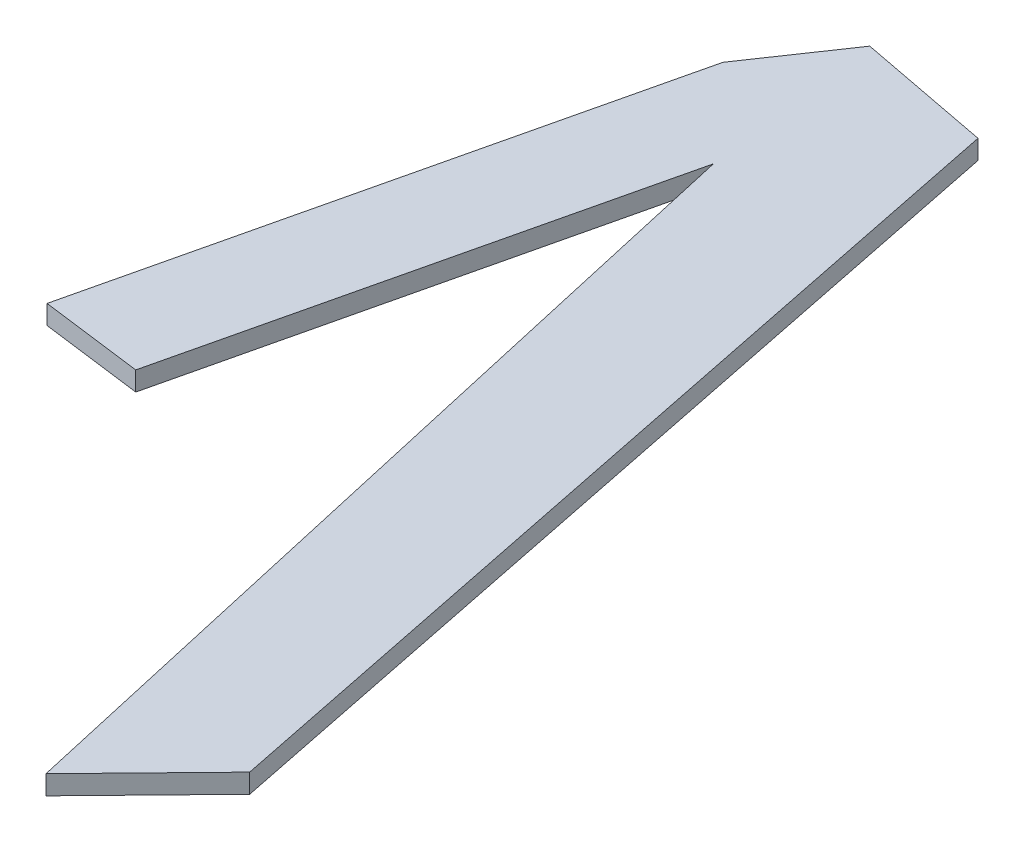
ISO-10303-21;
HEADER;
FILE_DESCRIPTION(('STEP AP214'),'2;1');
FILE_NAME('part.step','',(''),(''),'','','');
FILE_SCHEMA(('AUTOMOTIVE_DESIGN { 1 0 10303 214 1 1 1 1 }'));
ENDSEC;
DATA;
#1=APPLICATION_CONTEXT('core data for automotive mechanical design processes');
#2=APPLICATION_PROTOCOL_DEFINITION('international standard','automotive_design',2000,#1);
#3=PRODUCT_CONTEXT('',#1,'mechanical');
#4=PRODUCT('Part','Part','',(#3));
#5=PRODUCT_RELATED_PRODUCT_CATEGORY('part','',(#4));
#6=PRODUCT_DEFINITION_FORMATION('','',#4);
#7=PRODUCT_DEFINITION_CONTEXT('part definition',#1,'design');
#8=PRODUCT_DEFINITION('design','',#6,#7);
#9=PRODUCT_DEFINITION_SHAPE('','',#8);
#10=(LENGTH_UNIT() NAMED_UNIT(*) SI_UNIT(.MILLI.,.METRE.));
#11=(NAMED_UNIT(*) PLANE_ANGLE_UNIT() SI_UNIT($,.RADIAN.));
#12=(NAMED_UNIT(*) SI_UNIT($,.STERADIAN.) SOLID_ANGLE_UNIT());
#13=UNCERTAINTY_MEASURE_WITH_UNIT(LENGTH_MEASURE(1.E-05),#10,'distance_accuracy_value','');
#14=(GEOMETRIC_REPRESENTATION_CONTEXT(3) GLOBAL_UNCERTAINTY_ASSIGNED_CONTEXT((#13)) GLOBAL_UNIT_ASSIGNED_CONTEXT((#10,
#11,#12)) REPRESENTATION_CONTEXT('',''));
#15=CARTESIAN_POINT('',(0.,0.,0.));
#16=DIRECTION('',(0.,0.,1.));
#17=DIRECTION('',(1.,0.,0.));
#18=AXIS2_PLACEMENT_3D('',#15,#16,#17);
#19=CARTESIAN_POINT('',(10.1241005668503,1.,44.8720691267107));
#20=DIRECTION('',(0.975479763624145,0.,-0.220089142757614));
#21=DIRECTION('',(-0.220089142757614,0.,-0.975479763624145));
#22=AXIS2_PLACEMENT_3D('',#19,#20,#21);
#23=PLANE('',#22);
#24=DIRECTION('',(0.220089142757614,0.,0.975479763624145));
#25=VECTOR('',#24,1.);
#26=CARTESIAN_POINT('',(10.1241005668503,0.,44.8720691267107));
#27=LINE('',#26,#25);
#28=CARTESIAN_POINT('',(0.,0.,0.));
#29=VERTEX_POINT('',#28);
#30=CARTESIAN_POINT('',(10.1241005668503,0.,44.8720691267107));
#31=VERTEX_POINT('',#30);
#32=EDGE_CURVE('E140',#29,#31,#27,.T.);
#33=ORIENTED_EDGE('',*,*,#32,.T.);
#34=DIRECTION('',(0.,-1.,0.));
#35=VECTOR('',#34,1.);
#36=CARTESIAN_POINT('',(10.1241005668503,1.,44.8720691267107));
#37=LINE('',#36,#35);
#38=CARTESIAN_POINT('',(10.1241005668503,1.,44.8720691267107));
#39=VERTEX_POINT('',#38);
#40=EDGE_CURVE('E11',#39,#31,#37,.T.);
#41=ORIENTED_EDGE('',*,*,#40,.F.);
#42=DIRECTION('',(0.220089142757614,0.,0.975479763624145));
#43=VECTOR('',#42,1.);
#44=CARTESIAN_POINT('',(10.1241005668503,1.,44.8720691267107));
#45=LINE('',#44,#43);
#46=CARTESIAN_POINT('',(0.,1.,0.));
#47=VERTEX_POINT('',#46);
#48=EDGE_CURVE('E162',#47,#39,#45,.T.);
#49=ORIENTED_EDGE('',*,*,#48,.F.);
#50=DIRECTION('',(0.,-1.,0.));
#51=VECTOR('',#50,1.);
#52=CARTESIAN_POINT('',(0.,1.,0.));
#53=LINE('',#52,#51);
#54=EDGE_CURVE('E136',#47,#29,#53,.T.);
#55=ORIENTED_EDGE('',*,*,#54,.T.);
#56=EDGE_LOOP('',(#33,#41,#49,#55));
#57=FACE_BOUND('',#56,.T.);
#58=ADVANCED_FACE('F39',(#57),#23,.F.);
#59=CARTESIAN_POINT('',(15.3560523125179,1.,39.4983664059599));
#60=DIRECTION('',(-0.716493696100111,0.,-0.697593566089025));
#61=DIRECTION('',(-0.697593566089025,0.,0.716493696100111));
#62=AXIS2_PLACEMENT_3D('',#59,#60,#61);
#63=PLANE('',#62);
#64=DIRECTION('',(0.697593566089025,0.,-0.71649369610011));
#65=VECTOR('',#64,1.);
#66=CARTESIAN_POINT('',(15.3560523125179,0.,39.4983664059599));
#67=LINE('',#66,#65);
#68=CARTESIAN_POINT('',(15.3560523125179,0.,39.4983664059599));
#69=VERTEX_POINT('',#68);
#70=EDGE_CURVE('E144',#31,#69,#67,.T.);
#71=ORIENTED_EDGE('',*,*,#70,.T.);
#72=DIRECTION('',(0.,-1.,0.));
#73=VECTOR('',#72,1.);
#74=CARTESIAN_POINT('',(15.3560523125179,1.,39.4983664059599));
#75=LINE('',#74,#73);
#76=CARTESIAN_POINT('',(15.3560523125179,1.,39.4983664059599));
#77=VERTEX_POINT('',#76);
#78=EDGE_CURVE('E48',#77,#69,#75,.T.);
#79=ORIENTED_EDGE('',*,*,#78,.F.);
#80=DIRECTION('',(0.697593566089025,0.,-0.71649369610011));
#81=VECTOR('',#80,1.);
#82=CARTESIAN_POINT('',(15.3560523125179,1.,39.4983664059599));
#83=LINE('',#82,#81);
#84=EDGE_CURVE('E99',#39,#77,#83,.T.);
#85=ORIENTED_EDGE('',*,*,#84,.F.);
#86=ORIENTED_EDGE('',*,*,#40,.T.);
#87=EDGE_LOOP('',(#71,#79,#85,#86));
#88=FACE_BOUND('',#87,.T.);
#89=ADVANCED_FACE('F208',(#88),#63,.F.);
#90=CARTESIAN_POINT('',(5.73698486146157,1.,-8.03818312565874));
#91=DIRECTION('',(-0.980135041889043,0.,0.198331287650647));
#92=DIRECTION('',(0.198331287650647,0.,0.980135041889043));
#93=AXIS2_PLACEMENT_3D('',#90,#91,#92);
#94=PLANE('',#93);
#95=DIRECTION('',(-0.198331287650647,0.,-0.980135041889043));
#96=VECTOR('',#95,1.);
#97=CARTESIAN_POINT('',(5.73698486146157,0.,-8.03818312565874));
#98=LINE('',#97,#96);
#99=CARTESIAN_POINT('',(5.73698486146157,0.,-8.03818312565874));
#100=VERTEX_POINT('',#99);
#101=EDGE_CURVE('E147',#69,#100,#98,.T.);
#102=ORIENTED_EDGE('',*,*,#101,.T.);
#103=DIRECTION('',(0.,-1.,0.));
#104=VECTOR('',#103,1.);
#105=CARTESIAN_POINT('',(5.73698486146157,1.,-8.03818312565874));
#106=LINE('',#105,#104);
#107=CARTESIAN_POINT('',(5.73698486146157,1.,-8.03818312565874));
#108=VERTEX_POINT('',#107);
#109=EDGE_CURVE('E173',#108,#100,#106,.T.);
#110=ORIENTED_EDGE('',*,*,#109,.F.);
#111=DIRECTION('',(-0.198331287650647,0.,-0.980135041889043));
#112=VECTOR('',#111,1.);
#113=CARTESIAN_POINT('',(5.73698486146157,1.,-8.03818312565874));
#114=LINE('',#113,#112);
#115=EDGE_CURVE('E183',#77,#108,#114,.T.);
#116=ORIENTED_EDGE('',*,*,#115,.F.);
#117=ORIENTED_EDGE('',*,*,#78,.T.);
#118=EDGE_LOOP('',(#102,#110,#116,#117));
#119=FACE_BOUND('',#118,.T.);
#120=ADVANCED_FACE('F181',(#119),#94,.F.);
#121=CARTESIAN_POINT('',(-1.23599952786391,1.,-9.37515309773109));
#122=DIRECTION('',(-0.188305629869345,0.,0.982110477369786));
#123=DIRECTION('',(0.982110477369786,0.,0.188305629869345));
#124=AXIS2_PLACEMENT_3D('',#121,#122,#123);
#125=PLANE('',#124);
#126=DIRECTION('',(-0.982110477369786,0.,-0.188305629869345));
#127=VECTOR('',#126,1.);
#128=CARTESIAN_POINT('',(-1.23599952786391,0.,-9.37515309773109));
#129=LINE('',#128,#127);
#130=CARTESIAN_POINT('',(-1.23599952786391,0.,-9.37515309773109));
#131=VERTEX_POINT('',#130);
#132=EDGE_CURVE('E150',#100,#131,#129,.T.);
#133=ORIENTED_EDGE('',*,*,#132,.T.);
#134=DIRECTION('',(0.,-1.,0.));
#135=VECTOR('',#134,1.);
#136=CARTESIAN_POINT('',(-1.23599952786391,1.,-9.37515309773109));
#137=LINE('',#136,#135);
#138=CARTESIAN_POINT('',(-1.23599952786391,1.,-9.37515309773109));
#139=VERTEX_POINT('',#138);
#140=EDGE_CURVE('E169',#139,#131,#137,.T.);
#141=ORIENTED_EDGE('',*,*,#140,.F.);
#142=DIRECTION('',(-0.982110477369786,0.,-0.188305629869345));
#143=VECTOR('',#142,1.);
#144=CARTESIAN_POINT('',(-1.23599952786391,1.,-9.37515309773109));
#145=LINE('',#144,#143);
#146=EDGE_CURVE('E196',#108,#139,#145,.T.);
#147=ORIENTED_EDGE('',*,*,#146,.F.);
#148=ORIENTED_EDGE('',*,*,#109,.T.);
#149=EDGE_LOOP('',(#133,#141,#147,#148));
#150=FACE_BOUND('',#149,.T.);
#151=ADVANCED_FACE('F191',(#150),#125,.F.);
#152=CARTESIAN_POINT('',(-4.32854618814973,1.,-4.82694958931647));
#153=DIRECTION('',(0.826946092439021,0.,0.562281210961059));
#154=DIRECTION('',(0.562281210961059,0.,-0.826946092439021));
#155=AXIS2_PLACEMENT_3D('',#152,#153,#154);
#156=PLANE('',#155);
#157=DIRECTION('',(-0.562281210961059,0.,0.826946092439021));
#158=VECTOR('',#157,1.);
#159=CARTESIAN_POINT('',(-4.32854618814973,0.,-4.82694958931647));
#160=LINE('',#159,#158);
#161=CARTESIAN_POINT('',(-4.32854618814973,0.,-4.82694958931647));
#162=VERTEX_POINT('',#161);
#163=EDGE_CURVE('E153',#131,#162,#160,.T.);
#164=ORIENTED_EDGE('',*,*,#163,.T.);
#165=DIRECTION('',(0.,-1.,0.));
#166=VECTOR('',#165,1.);
#167=CARTESIAN_POINT('',(-4.32854618814973,1.,-4.82694958931647));
#168=LINE('',#167,#166);
#169=CARTESIAN_POINT('',(-4.32854618814973,1.,-4.82694958931647));
#170=VERTEX_POINT('',#169);
#171=EDGE_CURVE('E129',#170,#162,#168,.T.);
#172=ORIENTED_EDGE('',*,*,#171,.F.);
#173=DIRECTION('',(-0.562281210961059,0.,0.826946092439021));
#174=VECTOR('',#173,1.);
#175=CARTESIAN_POINT('',(-4.32854618814973,1.,-4.82694958931647));
#176=LINE('',#175,#174);
#177=EDGE_CURVE('E118',#139,#170,#176,.T.);
#178=ORIENTED_EDGE('',*,*,#177,.F.);
#179=ORIENTED_EDGE('',*,*,#140,.T.);
#180=EDGE_LOOP('',(#164,#172,#178,#179));
#181=FACE_BOUND('',#180,.T.);
#182=ADVANCED_FACE('F194',(#181),#156,.F.);
#183=CARTESIAN_POINT('',(-11.0504118040514,1.,23.6402073224961));
#184=DIRECTION('',(0.973236133737182,0.,0.229807371483818));
#185=DIRECTION('',(0.229807371483818,0.,-0.973236133737182));
#186=AXIS2_PLACEMENT_3D('',#183,#184,#185);
#187=PLANE('',#186);
#188=DIRECTION('',(-0.229807371483818,0.,0.973236133737182));
#189=VECTOR('',#188,1.);
#190=CARTESIAN_POINT('',(-11.0504118040514,0.,23.6402073224961));
#191=LINE('',#190,#189);
#192=CARTESIAN_POINT('',(-11.0504118040514,0.,23.6402073224961));
#193=VERTEX_POINT('',#192);
#194=EDGE_CURVE('E127',#162,#193,#191,.T.);
#195=ORIENTED_EDGE('',*,*,#194,.T.);
#196=DIRECTION('',(0.,-1.,0.));
#197=VECTOR('',#196,1.);
#198=CARTESIAN_POINT('',(-11.0504118040514,1.,23.6402073224961));
#199=LINE('',#198,#197);
#200=CARTESIAN_POINT('',(-11.0504118040514,1.,23.6402073224961));
#201=VERTEX_POINT('',#200);
#202=EDGE_CURVE('E124',#201,#193,#199,.T.);
#203=ORIENTED_EDGE('',*,*,#202,.F.);
#204=DIRECTION('',(-0.229807371483818,0.,0.973236133737182));
#205=VECTOR('',#204,1.);
#206=CARTESIAN_POINT('',(-11.0504118040514,1.,23.6402073224961));
#207=LINE('',#206,#205);
#208=EDGE_CURVE('E112',#170,#201,#207,.T.);
#209=ORIENTED_EDGE('',*,*,#208,.F.);
#210=ORIENTED_EDGE('',*,*,#171,.T.);
#211=EDGE_LOOP('',(#195,#203,#209,#210));
#212=FACE_BOUND('',#211,.T.);
#213=ADVANCED_FACE('F125',(#212),#187,.F.);
#214=CARTESIAN_POINT('',(-5.74518428709545,1.,24.3309033434296));
#215=DIRECTION('',(0.12910205998756,0.,-0.991631311580553));
#216=DIRECTION('',(-0.991631311580553,0.,-0.12910205998756));
#217=AXIS2_PLACEMENT_3D('',#214,#215,#216);
#218=PLANE('',#217);
#219=DIRECTION('',(0.991631311580553,0.,0.12910205998756));
#220=VECTOR('',#219,1.);
#221=CARTESIAN_POINT('',(-5.74518428709545,0.,24.3309033434296));
#222=LINE('',#221,#220);
#223=CARTESIAN_POINT('',(-5.74518428709545,0.,24.3309033434296));
#224=VERTEX_POINT('',#223);
#225=EDGE_CURVE('E85',#193,#224,#222,.T.);
#226=ORIENTED_EDGE('',*,*,#225,.T.);
#227=DIRECTION('',(0.,-1.,0.));
#228=VECTOR('',#227,1.);
#229=CARTESIAN_POINT('',(-5.74518428709545,1.,24.3309033434296));
#230=LINE('',#229,#228);
#231=CARTESIAN_POINT('',(-5.74518428709545,1.,24.3309033434296));
#232=VERTEX_POINT('',#231);
#233=EDGE_CURVE('E130',#232,#224,#230,.T.);
#234=ORIENTED_EDGE('',*,*,#233,.F.);
#235=DIRECTION('',(0.991631311580553,0.,0.12910205998756));
#236=VECTOR('',#235,1.);
#237=CARTESIAN_POINT('',(-5.74518428709545,1.,24.3309033434296));
#238=LINE('',#237,#236);
#239=EDGE_CURVE('E116',#201,#232,#238,.T.);
#240=ORIENTED_EDGE('',*,*,#239,.F.);
#241=ORIENTED_EDGE('',*,*,#202,.T.);
#242=EDGE_LOOP('',(#226,#234,#240,#241));
#243=FACE_BOUND('',#242,.T.);
#244=ADVANCED_FACE('F132',(#243),#218,.F.);
#245=CARTESIAN_POINT('',(0.,1.,0.));
#246=DIRECTION('',(-0.973236133737182,0.,-0.229807371483818));
#247=DIRECTION('',(-0.229807371483818,0.,0.973236133737182));
#248=AXIS2_PLACEMENT_3D('',#245,#246,#247);
#249=PLANE('',#248);
#250=DIRECTION('',(0.229807371483818,0.,-0.973236133737182));
#251=VECTOR('',#250,1.);
#252=CARTESIAN_POINT('',(0.,0.,0.));
#253=LINE('',#252,#251);
#254=EDGE_CURVE('E91',#224,#29,#253,.T.);
#255=ORIENTED_EDGE('',*,*,#254,.T.);
#256=ORIENTED_EDGE('',*,*,#54,.F.);
#257=DIRECTION('',(0.229807371483818,0.,-0.973236133737182));
#258=VECTOR('',#257,1.);
#259=CARTESIAN_POINT('',(0.,1.,0.));
#260=LINE('',#259,#258);
#261=EDGE_CURVE('E56',#232,#47,#260,.T.);
#262=ORIENTED_EDGE('',*,*,#261,.F.);
#263=ORIENTED_EDGE('',*,*,#233,.T.);
#264=EDGE_LOOP('',(#255,#256,#262,#263));
#265=FACE_BOUND('',#264,.T.);
#266=ADVANCED_FACE('F224',(#265),#249,.F.);
#267=CARTESIAN_POINT('',(0.,1.,0.));
#268=DIRECTION('',(0.,1.,0.));
#269=DIRECTION('',(0.,0.,1.));
#270=AXIS2_PLACEMENT_3D('',#267,#268,#269);
#271=PLANE('',#270);
#272=ORIENTED_EDGE('',*,*,#48,.T.);
#273=ORIENTED_EDGE('',*,*,#84,.T.);
#274=ORIENTED_EDGE('',*,*,#115,.T.);
#275=ORIENTED_EDGE('',*,*,#146,.T.);
#276=ORIENTED_EDGE('',*,*,#177,.T.);
#277=ORIENTED_EDGE('',*,*,#208,.T.);
#278=ORIENTED_EDGE('',*,*,#239,.T.);
#279=ORIENTED_EDGE('',*,*,#261,.T.);
#280=EDGE_LOOP('',(#272,#273,#274,#275,#276,#277,#278,#279));
#281=FACE_BOUND('',#280,.T.);
#282=ADVANCED_FACE('F114',(#281),#271,.T.);
#283=CARTESIAN_POINT('',(0.,0.,0.));
#284=DIRECTION('',(0.,1.,0.));
#285=DIRECTION('',(0.,0.,1.));
#286=AXIS2_PLACEMENT_3D('',#283,#284,#285);
#287=PLANE('',#286);
#288=ORIENTED_EDGE('',*,*,#32,.F.);
#289=ORIENTED_EDGE('',*,*,#254,.F.);
#290=ORIENTED_EDGE('',*,*,#225,.F.);
#291=ORIENTED_EDGE('',*,*,#194,.F.);
#292=ORIENTED_EDGE('',*,*,#163,.F.);
#293=ORIENTED_EDGE('',*,*,#132,.F.);
#294=ORIENTED_EDGE('',*,*,#101,.F.);
#295=ORIENTED_EDGE('',*,*,#70,.F.);
#296=EDGE_LOOP('',(#288,#289,#290,#291,#292,#293,#294,#295));
#297=FACE_BOUND('',#296,.T.);
#298=ADVANCED_FACE('F187',(#297),#287,.F.);
#299=CLOSED_SHELL('',(#58,#89,#120,#151,#182,#213,#244,#266,#282,#298));
#300=MANIFOLD_SOLID_BREP('B2',#299);
#301=ADVANCED_BREP_SHAPE_REPRESENTATION('',(#18,#300),#14);
#302=SHAPE_DEFINITION_REPRESENTATION(#9,#301);
ENDSEC;
END-ISO-10303-21;
